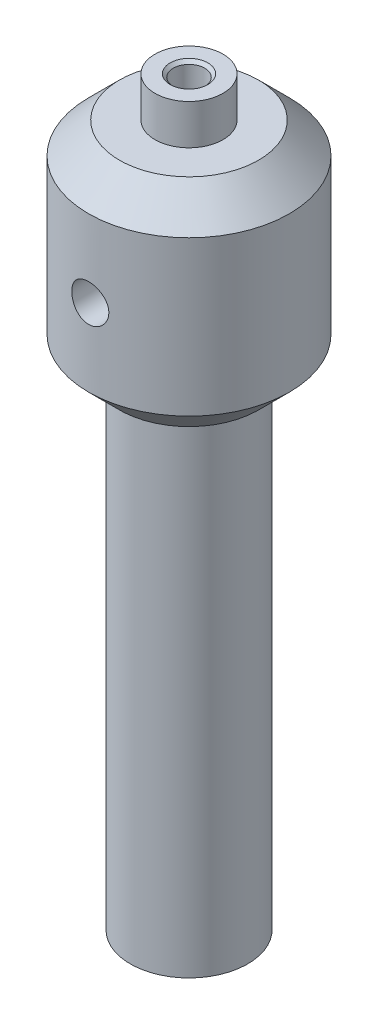
ISO-10303-21;
HEADER;
FILE_DESCRIPTION(('STEP AP214'),'2;1');
FILE_NAME('part.step','',(''),(''),'','','');
FILE_SCHEMA(('AUTOMOTIVE_DESIGN { 1 0 10303 214 1 1 1 1 }'));
ENDSEC;
DATA;
#1=APPLICATION_CONTEXT('core data for automotive mechanical design processes');
#2=APPLICATION_PROTOCOL_DEFINITION('international standard','automotive_design',2000,#1);
#3=PRODUCT_CONTEXT('',#1,'mechanical');
#4=PRODUCT('Part','Part','',(#3));
#5=PRODUCT_RELATED_PRODUCT_CATEGORY('part','',(#4));
#6=PRODUCT_DEFINITION_FORMATION('','',#4);
#7=PRODUCT_DEFINITION_CONTEXT('part definition',#1,'design');
#8=PRODUCT_DEFINITION('design','',#6,#7);
#9=PRODUCT_DEFINITION_SHAPE('','',#8);
#10=(LENGTH_UNIT() NAMED_UNIT(*) SI_UNIT(.MILLI.,.METRE.));
#11=(NAMED_UNIT(*) PLANE_ANGLE_UNIT() SI_UNIT($,.RADIAN.));
#12=(NAMED_UNIT(*) SI_UNIT($,.STERADIAN.) SOLID_ANGLE_UNIT());
#13=UNCERTAINTY_MEASURE_WITH_UNIT(LENGTH_MEASURE(1.E-05),#10,'distance_accuracy_value','');
#14=(GEOMETRIC_REPRESENTATION_CONTEXT(3) GLOBAL_UNCERTAINTY_ASSIGNED_CONTEXT((#13)) GLOBAL_UNIT_ASSIGNED_CONTEXT((#10,
#11,#12)) REPRESENTATION_CONTEXT('',''));
#15=CARTESIAN_POINT('',(0.,0.,0.));
#16=DIRECTION('',(0.,0.,1.));
#17=DIRECTION('',(1.,0.,0.));
#18=AXIS2_PLACEMENT_3D('',#15,#16,#17);
#19=CARTESIAN_POINT('',(19.,0.,0.));
#20=DIRECTION('',(0.,-1.,0.));
#21=DIRECTION('',(0.,0.,-1.));
#22=AXIS2_PLACEMENT_3D('',#19,#20,#21);
#23=PLANE('',#22);
#24=CARTESIAN_POINT('',(0.,0.,0.));
#25=DIRECTION('',(0.,-1.,0.));
#26=DIRECTION('',(0.,0.,-1.));
#27=AXIS2_PLACEMENT_3D('',#24,#25,#26);
#28=CIRCLE('',#27,19.);
#29=CARTESIAN_POINT('',(0.,0.,-19.));
#30=VERTEX_POINT('',#29);
#31=EDGE_CURVE('E62',#30,#30,#28,.T.);
#32=ORIENTED_EDGE('',*,*,#31,.T.);
#33=EDGE_LOOP('',(#32));
#34=FACE_BOUND('',#33,.T.);
#35=ADVANCED_FACE('F41',(#34),#23,.T.);
#36=CARTESIAN_POINT('',(0.,240.,0.));
#37=DIRECTION('',(0.,1.,0.));
#38=DIRECTION('',(0.,0.,1.));
#39=AXIS2_PLACEMENT_3D('',#36,#37,#38);
#40=PLANE('',#39);
#41=CARTESIAN_POINT('',(0.,240.,0.));
#42=DIRECTION('',(0.,1.,0.));
#43=DIRECTION('',(0.,0.,1.));
#44=AXIS2_PLACEMENT_3D('',#41,#42,#43);
#45=CIRCLE('',#44,6.10000000000002);
#46=CARTESIAN_POINT('',(0.,240.,6.10000000000002));
#47=VERTEX_POINT('',#46);
#48=EDGE_CURVE('E11',#47,#47,#45,.F.);
#49=ORIENTED_EDGE('',*,*,#48,.T.);
#50=EDGE_LOOP('',(#49));
#51=FACE_BOUND('',#50,.T.);
#52=CARTESIAN_POINT('',(0.,240.,0.));
#53=DIRECTION('',(0.,-1.,0.));
#54=DIRECTION('',(0.,0.,-1.));
#55=AXIS2_PLACEMENT_3D('',#52,#53,#54);
#56=CIRCLE('',#55,11.);
#57=CARTESIAN_POINT('',(0.,240.,-11.));
#58=VERTEX_POINT('',#57);
#59=EDGE_CURVE('E85',#58,#58,#56,.T.);
#60=ORIENTED_EDGE('',*,*,#59,.F.);
#61=EDGE_LOOP('',(#60));
#62=FACE_BOUND('',#61,.T.);
#63=ADVANCED_FACE('F129',(#51,#62),#40,.T.);
#64=CARTESIAN_POINT('',(0.,0.,0.));
#65=DIRECTION('',(0.,-1.,0.));
#66=DIRECTION('',(0.,0.,-1.));
#67=AXIS2_PLACEMENT_3D('',#64,#65,#66);
#68=CYLINDRICAL_SURFACE('',#67,11.);
#69=ORIENTED_EDGE('',*,*,#59,.T.);
#70=EDGE_LOOP('',(#69));
#71=FACE_BOUND('',#70,.T.);
#72=CARTESIAN_POINT('',(0.,227.,0.));
#73=DIRECTION('',(0.,-1.,0.));
#74=DIRECTION('',(0.,0.,-1.));
#75=AXIS2_PLACEMENT_3D('',#72,#73,#74);
#76=CIRCLE('',#75,11.);
#77=CARTESIAN_POINT('',(0.,227.,-11.));
#78=VERTEX_POINT('',#77);
#79=EDGE_CURVE('E82',#78,#78,#76,.T.);
#80=ORIENTED_EDGE('',*,*,#79,.F.);
#81=EDGE_LOOP('',(#80));
#82=FACE_BOUND('',#81,.T.);
#83=ADVANCED_FACE('F134',(#71,#82),#68,.T.);
#84=CARTESIAN_POINT('',(11.,227.,0.));
#85=DIRECTION('',(0.,1.,0.));
#86=DIRECTION('',(0.,0.,1.));
#87=AXIS2_PLACEMENT_3D('',#84,#85,#86);
#88=PLANE('',#87);
#89=ORIENTED_EDGE('',*,*,#79,.T.);
#90=EDGE_LOOP('',(#89));
#91=FACE_BOUND('',#90,.T.);
#92=CARTESIAN_POINT('',(0.,227.,0.));
#93=DIRECTION('',(0.,-1.,0.));
#94=DIRECTION('',(0.,0.,-1.));
#95=AXIS2_PLACEMENT_3D('',#92,#93,#94);
#96=CIRCLE('',#95,22.5);
#97=CARTESIAN_POINT('',(0.,227.,-22.5));
#98=VERTEX_POINT('',#97);
#99=EDGE_CURVE('E79',#98,#98,#96,.T.);
#100=ORIENTED_EDGE('',*,*,#99,.F.);
#101=EDGE_LOOP('',(#100));
#102=FACE_BOUND('',#101,.T.);
#103=ADVANCED_FACE('F140',(#91,#102),#88,.T.);
#104=CARTESIAN_POINT('',(0.,217.,0.));
#105=DIRECTION('',(0.,-1.,0.));
#106=DIRECTION('',(0.,0.,-1.));
#107=AXIS2_PLACEMENT_3D('',#104,#105,#106);
#108=CONICAL_SURFACE('',#107,32.5000000000002,0.785398163397456);
#109=ORIENTED_EDGE('',*,*,#99,.T.);
#110=EDGE_LOOP('',(#109));
#111=FACE_BOUND('',#110,.T.);
#112=CARTESIAN_POINT('',(0.,217.,0.));
#113=DIRECTION('',(0.,-1.,0.));
#114=DIRECTION('',(0.,0.,-1.));
#115=AXIS2_PLACEMENT_3D('',#112,#113,#114);
#116=CIRCLE('',#115,32.5000000000002);
#117=CARTESIAN_POINT('',(0.,217.,-32.5000000000002));
#118=VERTEX_POINT('',#117);
#119=EDGE_CURVE('E76',#118,#118,#116,.T.);
#120=ORIENTED_EDGE('',*,*,#119,.F.);
#121=EDGE_LOOP('',(#120));
#122=FACE_BOUND('',#121,.T.);
#123=ADVANCED_FACE('F125',(#111,#122),#108,.T.);
#124=CARTESIAN_POINT('',(0.,0.,0.));
#125=DIRECTION('',(0.,-1.,0.));
#126=DIRECTION('',(0.,0.,-1.));
#127=AXIS2_PLACEMENT_3D('',#124,#125,#126);
#128=CYLINDRICAL_SURFACE('',#127,32.5000000000002);
#129=CARTESIAN_POINT('',(0.,198.,-32.5000000000002));
#130=CARTESIAN_POINT('',(0.167047387974415,198.000002951048,-32.5000014014325));
#131=CARTESIAN_POINT('',(0.334056414535266,197.993021813711,-32.4987097779942));
#132=CARTESIAN_POINT('',(0.666922031200579,197.965157067144,-32.493582396858));
#133=CARTESIAN_POINT('',(0.832778404858182,197.944270914476,-32.4897461737149));
#134=CARTESIAN_POINT('',(1.16218709311425,197.888738536972,-32.4796320956754));
#135=CARTESIAN_POINT('',(1.32573803450885,197.854084442608,-32.4733528444275));
#136=CARTESIAN_POINT('',(1.64934345668916,197.771271041131,-32.4585259988951));
#137=CARTESIAN_POINT('',(1.80939663010089,197.72310677428,-32.4499775716322));
#138=CARTESIAN_POINT('',(2.12461909376536,197.613714664144,-32.4308633624609));
#139=CARTESIAN_POINT('',(2.27979434281074,197.552503531731,-32.4203001629445));
#140=CARTESIAN_POINT('',(2.58446206954016,197.417410303793,-32.397436680922));
#141=CARTESIAN_POINT('',(2.73395242740516,197.34352353721,-32.3851357583493));
#142=CARTESIAN_POINT('',(3.02610605021081,197.1836663224,-32.359143729032));
#143=CARTESIAN_POINT('',(3.16877249289802,197.097701573525,-32.345453278818));
#144=CARTESIAN_POINT('',(3.44644953798866,196.914233178875,-32.3170461894861));
#145=CARTESIAN_POINT('',(3.5814572600222,196.816725233819,-32.3023291688643));
#146=CARTESIAN_POINT('',(3.84417623264325,196.609831402662,-32.2721237443793));
#147=CARTESIAN_POINT('',(3.97180053780939,196.500336011848,-32.2566290755319));
#148=CARTESIAN_POINT('',(4.21744501771729,196.27099554245,-32.2254324395733));
#149=CARTESIAN_POINT('',(4.33546161754138,196.151146645324,-32.2097303978038));
#150=CARTESIAN_POINT('',(4.56100087376238,195.901986604755,-32.1785678807608));
#151=CARTESIAN_POINT('',(4.66852662807659,195.772678274512,-32.1631073353137));
#152=CARTESIAN_POINT('',(4.87241936155105,195.505394933914,-32.1328517105624));
#153=CARTESIAN_POINT('',(4.96878221059233,195.36741674477,-32.1180568787933));
#154=CARTESIAN_POINT('',(5.15028638072951,195.082734596099,-32.0894539852936));
#155=CARTESIAN_POINT('',(5.23534055334004,194.935974240216,-32.0756539245592));
#156=CARTESIAN_POINT('',(5.39279796033512,194.635620840363,-32.0495569658408));
#157=CARTESIAN_POINT('',(5.46519645843932,194.482025265232,-32.0372606311285));
#158=CARTESIAN_POINT('',(5.59673049546195,194.169186629211,-32.0145447471989));
#159=CARTESIAN_POINT('',(5.65587180506682,194.00994606061,-32.0041243817863));
#160=CARTESIAN_POINT('',(5.76049139817701,193.68689735635,-31.9854579827383));
#161=CARTESIAN_POINT('',(5.80596470935164,193.523087582069,-31.9772127405321));
#162=CARTESIAN_POINT('',(5.9203689764524,193.030409159429,-31.9563064605377));
#163=CARTESIAN_POINT('',(5.96891901071691,192.696386732529,-31.9471824578803));
#164=CARTESIAN_POINT('',(6.0093777303918,192.025005778692,-31.9395955731687));
#165=CARTESIAN_POINT('',(6.00129133836947,191.687647544233,-31.9411317645813));
#166=CARTESIAN_POINT('',(5.92929348899846,191.023490395548,-31.9545734655923));
#167=CARTESIAN_POINT('',(5.86609521960248,190.696611688162,-31.9663464973698));
#168=CARTESIAN_POINT('',(5.68676990030916,190.058190702375,-31.9987323168556));
#169=CARTESIAN_POINT('',(5.57064066366295,189.746649058187,-32.0193454697759));
#170=CARTESIAN_POINT('',(5.28805391152012,189.145635615852,-32.067226849282));
#171=CARTESIAN_POINT('',(5.12130716064853,188.856302952439,-32.0945331440216));
#172=CARTESIAN_POINT('',(4.74242193954202,188.30945617947,-32.1526990787037));
#173=CARTESIAN_POINT('',(4.53027899873099,188.051945207629,-32.1835590684725));
#174=CARTESIAN_POINT('',(4.0627715303044,187.571927527527,-32.245933335709));
#175=CARTESIAN_POINT('',(3.80679653324244,187.350015311049,-32.2774504088929));
#176=CARTESIAN_POINT('',(3.2609369532924,186.952194045544,-32.3371543132374));
#177=CARTESIAN_POINT('',(2.97105204985808,186.776285431433,-32.3653411129124));
#178=CARTESIAN_POINT('',(2.36499021324981,186.475381996096,-32.4152628733549));
#179=CARTESIAN_POINT('',(2.04878258243285,186.350447651793,-32.4369901621848));
#180=CARTESIAN_POINT('',(1.39937919492224,186.155633070481,-32.4714852504941));
#181=CARTESIAN_POINT('',(1.06618519067571,186.085747166433,-32.4842539722109));
#182=CARTESIAN_POINT('',(0.397383215203499,186.003837604151,-32.4992669465581));
#183=CARTESIAN_POINT('',(0.0618782483745503,185.990999171889,-32.5016593853385));
#184=CARTESIAN_POINT('',(-0.606484909661271,186.021365382145,-32.4960590637381));
#185=CARTESIAN_POINT('',(-0.939343226021676,186.064567358601,-32.4880667973983));
#186=CARTESIAN_POINT('',(-1.59038992422883,186.205110554301,-32.4626872786009));
#187=CARTESIAN_POINT('',(-1.90867005010831,186.302040788101,-32.4453713741911));
#188=CARTESIAN_POINT('',(-2.52446187534885,186.546845306371,-32.4032781211014));
#189=CARTESIAN_POINT('',(-2.82197219688196,186.694722966739,-32.3785002779895));
#190=CARTESIAN_POINT('',(-3.39126548533968,187.039036730946,-32.323862034222));
#191=CARTESIAN_POINT('',(-3.66274135122632,187.235972303467,-32.2939504055838));
#192=CARTESIAN_POINT('',(-4.16908432952835,187.672135346245,-32.2324977111766));
#193=CARTESIAN_POINT('',(-4.40394813141742,187.911366636785,-32.2009564984006));
#194=CARTESIAN_POINT('',(-4.83348551479758,188.429009489889,-32.139309512383));
#195=CARTESIAN_POINT('',(-5.02760384169283,188.707885037177,-32.1092273941106));
#196=CARTESIAN_POINT('',(-5.36623841659488,189.29477862801,-32.0543763326786));
#197=CARTESIAN_POINT('',(-5.51075647264597,189.602795608759,-32.0296071958608));
#198=CARTESIAN_POINT('',(-5.74529998594317,190.237733868761,-31.9883683472534));
#199=CARTESIAN_POINT('',(-5.83558308225325,190.564557555855,-31.9718594593374));
#200=CARTESIAN_POINT('',(-5.95987109852571,191.229255527096,-31.9489294956882));
#201=CARTESIAN_POINT('',(-5.9938821523063,191.567128602733,-31.9425073204776));
#202=CARTESIAN_POINT('',(-6.00189486714629,192.071678138939,-31.9409937887348));
#203=CARTESIAN_POINT('',(-5.99758283494899,192.238274119685,-31.9418077558085));
#204=CARTESIAN_POINT('',(-5.97513253775216,192.570482113081,-31.946016487723));
#205=CARTESIAN_POINT('',(-5.95699949373229,192.736094473498,-31.9494102780172));
#206=CARTESIAN_POINT('',(-5.9070336299794,193.065215620485,-31.9586855963116));
#207=CARTESIAN_POINT('',(-5.87519596756223,193.228723642411,-31.9645680036806));
#208=CARTESIAN_POINT('',(-5.79808429743152,193.552378272652,-31.9786453020171));
#209=CARTESIAN_POINT('',(-5.75281510317849,193.712526063197,-31.9868393645047));
#210=CARTESIAN_POINT('',(-5.6492524053349,194.028176622226,-32.0052918435402));
#211=CARTESIAN_POINT('',(-5.59097742811479,194.183685644782,-32.0155473216156));
#212=CARTESIAN_POINT('',(-5.46182056358106,194.489178204963,-32.0378339830432));
#213=CARTESIAN_POINT('',(-5.39094316290595,194.63916368618,-32.0498645341862));
#214=CARTESIAN_POINT('',(-5.23704527717771,194.932717658784,-32.0753712303173));
#215=CARTESIAN_POINT('',(-5.15401988366899,195.076283525534,-32.088847959051));
#216=CARTESIAN_POINT('',(-4.97646002457541,195.35593046589,-32.1168634444834));
#217=CARTESIAN_POINT('',(-4.88192955508218,195.492014114611,-32.1314018317355));
#218=CARTESIAN_POINT('',(-4.68049098336987,195.757821711608,-32.1613669342855));
#219=CARTESIAN_POINT('',(-4.5734194828492,195.887420733857,-32.1768036560181));
#220=CARTESIAN_POINT('',(-4.34884138360293,196.137120438952,-32.2079248208259));
#221=CARTESIAN_POINT('',(-4.23133849380697,196.257224469299,-32.2236091742368));
#222=CARTESIAN_POINT('',(-3.98659111868758,196.487238515557,-32.2548029719055));
#223=CARTESIAN_POINT('',(-3.85934088957488,196.597142435201,-32.2703123067587));
#224=CARTESIAN_POINT('',(-3.59607102507715,196.805880120683,-32.3007093143121));
#225=CARTESIAN_POINT('',(-3.46005463969105,196.904717952427,-32.3155972140708));
#226=CARTESIAN_POINT('',(-3.1788578643114,197.091523494682,-32.3444742543557));
#227=CARTESIAN_POINT('',(-3.03360543194256,197.179384266206,-32.3584539984356));
#228=CARTESIAN_POINT('',(-2.7361329268486,197.342503362623,-32.3849635764461));
#229=CARTESIAN_POINT('',(-2.58391544613779,197.417766327943,-32.3974939437297));
#230=CARTESIAN_POINT('',(-2.27362825228652,197.555121589046,-32.4207463085124));
#231=CARTESIAN_POINT('',(-2.11556241225017,197.617222424426,-32.4314694775918));
#232=CARTESIAN_POINT('',(-1.79467228319851,197.727823393983,-32.4508090321668));
#233=CARTESIAN_POINT('',(-1.63184896912176,197.776326293468,-32.45942584597));
#234=CARTESIAN_POINT('',(-1.22783758338942,197.878204607649,-32.4776798969896));
#235=CARTESIAN_POINT('',(-0.98458873619416,197.923819554013,-32.486008622075));
#236=CARTESIAN_POINT('',(-0.49419856019614,197.984714702236,-32.4971675709577));
#237=CARTESIAN_POINT('',(-0.247057325390453,197.999995635502,-32.4999979273301));
#238=CARTESIAN_POINT('',(0.,198.,-32.5000000000002));
#239=B_SPLINE_CURVE_WITH_KNOTS('',3,(#129,#130,#131,#132,#133,#134,#135,#136,#137,#138,#139,
#140,#141,#142,#143,#144,#145,#146,#147,#148,#149,#150,#151,#152,#153,#154,#155,#156,#157,#158,
#159,#160,#161,#162,#163,#164,#165,#166,#167,#168,#169,#170,#171,#172,#173,#174,#175,#176,#177,
#178,#179,#180,#181,#182,#183,#184,#185,#186,#187,#188,#189,#190,#191,#192,#193,#194,#195,#196,
#197,#198,#199,#200,#201,#202,#203,#204,#205,#206,#207,#208,#209,#210,#211,#212,#213,#214,#215,
#216,#217,#218,#219,#220,#221,#222,#223,#224,#225,#226,#227,#228,#229,#230,#231,#232,#233,#234,
#235,#236,#237,#238),.UNSPECIFIED.,.T.,.F.,(4,2,2,2,2,2,2,2,2,2,2,2,2,2,2,2,2,2,2,2,2,2,2,2,2,2,
2,2,2,2,2,2,2,2,2,2,2,2,2,2,2,2,2,2,2,2,2,2,2,2,2,2,2,2,4),(0.,0.500925415856109,
1.00194248373588,1.50324633759921,2.00473446721871,2.50558409263794,3.00661868254917,
3.50741763369361,4.00840369848706,4.51442366052909,5.0206310543591,5.52668851124021,
6.03293260831374,6.5428761417078,7.05301011052263,7.5629215914048,8.07301835093453,
9.08064758459464,10.088189241028,11.0828828743722,12.0776176054417,13.0781469402784,
14.0787748517292,15.0946807664379,16.1105962851585,17.1277136264852,18.144726245551,
19.147165819545,20.1495577053301,21.1443857119725,22.1392796509597,23.1447493595254,
24.1503099317355,25.1687925873858,26.1872381130497,27.2008065243771,28.2142644464847,
28.7137382676778,29.2130235027488,29.7124853110036,30.2117683427893,30.7103446486533,
31.2087438085096,31.7073449079496,32.2057733184101,32.711626137455,33.2172998130326,
33.7232737924587,34.2290612523622,34.7394448349454,35.2496400010553,35.7595031320703,
36.2692625008281,37.0101317779487,37.7509831912043),.UNSPECIFIED.);
#240=CARTESIAN_POINT('',(0.,198.,-32.5000000000002));
#241=VERTEX_POINT('',#240);
#242=EDGE_CURVE('E96',#241,#241,#239,.T.);
#243=ORIENTED_EDGE('',*,*,#242,.F.);
#244=EDGE_LOOP('',(#243));
#245=FACE_BOUND('',#244,.T.);
#246=CARTESIAN_POINT('',(6.,192.,31.9413525073691));
#247=CARTESIAN_POINT('',(6.00000295853529,192.16702010578,31.9413510155269));
#248=CARTESIAN_POINT('',(5.99302407715925,192.334001842829,31.942665010277));
#249=CARTESIAN_POINT('',(5.96516856930218,192.666812138617,31.9478791151136));
#250=CARTESIAN_POINT('',(5.94428939706712,192.832640480497,31.9517796989177));
#251=CARTESIAN_POINT('',(5.88877610738075,193.161992514205,31.9620573065451));
#252=CARTESIAN_POINT('',(5.85413407949497,193.325514824534,31.968435754516));
#253=CARTESIAN_POINT('',(5.77135045100129,193.649062361184,31.9834845406128));
#254=CARTESIAN_POINT('',(5.72320388723112,193.80908627843,31.9921557212923));
#255=CARTESIAN_POINT('',(5.61385452206621,194.124246490147,32.0115246934937));
#256=CARTESIAN_POINT('',(5.55266878540925,194.279388871567,32.0222198341719));
#257=CARTESIAN_POINT('',(5.41763251250718,194.583993638257,32.0453420785028));
#258=CARTESIAN_POINT('',(5.34377730623473,194.733453904166,32.057769820483));
#259=CARTESIAN_POINT('',(5.18398806674358,195.025552629714,32.0839962627163));
#260=CARTESIAN_POINT('',(5.09805970034271,195.168194247985,32.097794318895));
#261=CARTESIAN_POINT('',(4.91466745622353,195.445828347411,32.1263856672195));
#262=CARTESIAN_POINT('',(4.81719927981946,195.580817950254,32.1411793293465));
#263=CARTESIAN_POINT('',(4.61034548396164,195.843560996205,32.1715052735181));
#264=CARTESIAN_POINT('',(4.50084597428911,195.971224083592,32.187043658493));
#265=CARTESIAN_POINT('',(4.27148905640616,196.216946537089,32.2182832804326));
#266=CARTESIAN_POINT('',(4.15162782612189,196.335002327964,32.2339845755937));
#267=CARTESIAN_POINT('',(3.90243530466569,196.560618341113,32.2651012097676));
#268=CARTESIAN_POINT('',(3.77310687922168,196.668181716642,32.2805166335574));
#269=CARTESIAN_POINT('',(3.50577559302648,196.872146891922,32.3106427456996));
#270=CARTESIAN_POINT('',(3.36776955266251,196.968544563181,32.3253531722097));
#271=CARTESIAN_POINT('',(3.08306471017447,197.150088678451,32.3537527138726));
#272=CARTESIAN_POINT('',(2.93631162303768,197.235151271087,32.3674339230624));
#273=CARTESIAN_POINT('',(2.63597199364875,197.39262626248,32.3932768150284));
#274=CARTESIAN_POINT('',(2.48238292019942,197.465033925708,32.4054379284952));
#275=CARTESIAN_POINT('',(2.16955749285648,197.596586679502,32.427882597685));
#276=CARTESIAN_POINT('',(2.01032361299023,197.655737499093,32.438166964097));
#277=CARTESIAN_POINT('',(1.6872898594089,197.760376316327,32.4565759252549));
#278=CARTESIAN_POINT('',(1.52348834648181,197.805859338139,32.4646997333149));
#279=CARTESIAN_POINT('',(1.03085331580682,197.920290031532,32.4852880303494));
#280=CARTESIAN_POINT('',(0.696870045496306,197.96886042554,32.4942588120659));
#281=CARTESIAN_POINT('',(0.0255664198837383,198.009373397857,32.5017263371875));
#282=CARTESIAN_POINT('',(-0.31175365726685,198.001320657124,32.5002239463957));
#283=CARTESIAN_POINT('',(-0.976054278284206,197.929377926863,32.487017631085));
#284=CARTESIAN_POINT('',(-1.30311063675732,197.866167164928,32.4754378068715));
#285=CARTESIAN_POINT('',(-1.94188038235149,197.686755984159,32.4435119174274));
#286=CARTESIAN_POINT('',(-2.25359322258673,197.570553678071,32.423165539984));
#287=CARTESIAN_POINT('',(-2.85482127182886,197.287811975478,32.3757858792466));
#288=CARTESIAN_POINT('',(-3.14420524520471,197.12099977746,32.3487165042423));
#289=CARTESIAN_POINT('',(-3.69112726413706,196.741972872398,32.2908861364094));
#290=CARTESIAN_POINT('',(-3.94866216241414,196.529753683949,32.2601247793354));
#291=CARTESIAN_POINT('',(-4.42860067861482,196.062189714966,32.1977799600075));
#292=CARTESIAN_POINT('',(-4.65042497033573,195.806250600413,32.1661910748593));
#293=CARTESIAN_POINT('',(-5.04808559706013,195.260494957064,32.1061894073336));
#294=CARTESIAN_POINT('',(-5.22392129912474,194.970677962086,32.0777766686722));
#295=CARTESIAN_POINT('',(-5.52477115699434,194.364639341077,32.0273370970674));
#296=CARTESIAN_POINT('',(-5.64970322536738,194.048376049523,32.0053205950003));
#297=CARTESIAN_POINT('',(-5.84449643174312,193.398850988088,31.9703261346545));
#298=CARTESIAN_POINT('',(-5.9143636046489,193.065591085235,31.9573471859126));
#299=CARTESIAN_POINT('',(-5.99620229168364,192.396751015839,31.9420927158334));
#300=CARTESIAN_POINT('',(-6.00900518397556,192.061275977497,31.9396635072361));
#301=CARTESIAN_POINT('',(-5.97857858316261,191.392981018201,31.9453725765506));
#302=CARTESIAN_POINT('',(-5.93535177193744,191.060160970932,31.9535103486705));
#303=CARTESIAN_POINT('',(-5.79480586142508,190.409343291511,31.9792934650262));
#304=CARTESIAN_POINT('',(-5.69792075735498,190.091248642484,31.9968624934419));
#305=CARTESIAN_POINT('',(-5.45326809850267,189.475807966959,32.0394630353326));
#306=CARTESIAN_POINT('',(-5.30549689375587,189.178463430668,32.0644950840988));
#307=CARTESIAN_POINT('',(-4.96134651750513,188.609295414165,32.1195522144907));
#308=CARTESIAN_POINT('',(-4.76444105467972,188.337795366043,32.1496301190141));
#309=CARTESIAN_POINT('',(-4.32832188526401,187.831389726128,32.2112404635559));
#310=CARTESIAN_POINT('',(-4.08910449593802,187.596487323062,32.2427730300081));
#311=CARTESIAN_POINT('',(-3.57144762775753,187.166848798412,32.3042327039955));
#312=CARTESIAN_POINT('',(-3.29254111714155,186.972671136173,32.3341337897013));
#313=CARTESIAN_POINT('',(-2.70556807005943,186.633932586305,32.3885259688711));
#314=CARTESIAN_POINT('',(-2.39750263248844,186.489369829818,32.4130172660945));
#315=CARTESIAN_POINT('',(-1.76258072681929,186.254800177585,32.4537208129972));
#316=CARTESIAN_POINT('',(-1.435829080217,186.164516450471,32.4699750052545));
#317=CARTESIAN_POINT('',(-0.771284675971637,186.040202759824,32.492542256214));
#318=CARTESIAN_POINT('',(-0.433493046619088,186.00616706594,32.4988563275775));
#319=CARTESIAN_POINT('',(0.0710321096354826,185.998095984879,32.5003540565633));
#320=CARTESIAN_POINT('',(0.237682638844521,186.002392189745,32.4995572690842));
#321=CARTESIAN_POINT('',(0.57000147357403,186.024820064111,32.4954244329522));
#322=CARTESIAN_POINT('',(0.73567012605006,186.042946511486,32.4920893427313));
#323=CARTESIAN_POINT('',(1.06490505616126,186.092908806817,32.4829668638017));
#324=CARTESIAN_POINT('',(1.22847057559065,186.124749463685,32.4771786148999));
#325=CARTESIAN_POINT('',(1.55224085017753,186.201877246057,32.4633144843587));
#326=CARTESIAN_POINT('',(1.71244678909536,186.247159547125,32.4552394235428));
#327=CARTESIAN_POINT('',(2.02822736208988,186.350763583394,32.4370355937858));
#328=CARTESIAN_POINT('',(2.18380784113109,186.409067993915,32.4269095551276));
#329=CARTESIAN_POINT('',(2.48943892302125,186.538295909441,32.404878671661));
#330=CARTESIAN_POINT('',(2.63949147339193,186.609214917922,32.3929744609305));
#331=CARTESIAN_POINT('',(2.9331721059094,186.763206776707,32.3677035827216));
#332=CARTESIAN_POINT('',(3.07679757825834,186.846284506776,32.3543363286128));
#333=CARTESIAN_POINT('',(3.35655401432149,187.023957979389,32.3265108155522));
#334=CARTESIAN_POINT('',(3.49268756010243,187.118549717111,32.312052936605));
#335=CARTESIAN_POINT('',(3.75850222746007,187.32005643899,32.2822211930689));
#336=CARTESIAN_POINT('',(3.88806348648545,187.427128074562,32.2668371982914));
#337=CARTESIAN_POINT('',(4.13768673508279,187.651698606635,32.2357777361539));
#338=CARTESIAN_POINT('',(4.25775207244291,187.769193797036,32.2201023739443));
#339=CARTESIAN_POINT('',(4.48768949162614,188.013917992755,32.1888818740742));
#340=CARTESIAN_POINT('',(4.59755543208625,188.141152779532,32.1733368199348));
#341=CARTESIAN_POINT('',(4.8062192058397,188.40438395591,32.1428277311299));
#342=CARTESIAN_POINT('',(4.9050210981696,188.540377103324,32.1278634847104));
#343=CARTESIAN_POINT('',(5.09178042683274,188.821553772614,32.098797335525));
#344=CARTESIAN_POINT('',(5.17962815718121,188.966811164144,32.0847047744442));
#345=CARTESIAN_POINT('',(5.34272083193666,189.264291908901,32.0579500798173));
#346=CARTESIAN_POINT('',(5.41797041710961,189.416512670611,32.0452874201018));
#347=CARTESIAN_POINT('',(5.55529909721156,189.726805727056,32.0217661734499));
#348=CARTESIAN_POINT('',(5.61738677931815,189.884874127068,32.0109064112643));
#349=CARTESIAN_POINT('',(5.72796202752486,190.205770370251,31.9913049603578));
#350=CARTESIAN_POINT('',(5.7764523672906,190.36859723527,31.9825628397176));
#351=CARTESIAN_POINT('',(5.87827970156251,190.772538416944,31.9640370171762));
#352=CARTESIAN_POINT('',(5.92386631533029,191.015711803916,31.9555746068074));
#353=CARTESIAN_POINT('',(5.9847238866214,191.505951494842,31.944233526856));
#354=CARTESIAN_POINT('',(5.99999562504256,191.753017698353,31.9413547134425));
#355=CARTESIAN_POINT('',(6.,192.,31.9413525073691));
#356=B_SPLINE_CURVE_WITH_KNOTS('',3,(#246,#247,#248,#249,#250,#251,#252,#253,#254,#255,#256,
#257,#258,#259,#260,#261,#262,#263,#264,#265,#266,#267,#268,#269,#270,#271,#272,#273,#274,#275,
#276,#277,#278,#279,#280,#281,#282,#283,#284,#285,#286,#287,#288,#289,#290,#291,#292,#293,#294,
#295,#296,#297,#298,#299,#300,#301,#302,#303,#304,#305,#306,#307,#308,#309,#310,#311,#312,#313,
#314,#315,#316,#317,#318,#319,#320,#321,#322,#323,#324,#325,#326,#327,#328,#329,#330,#331,#332,
#333,#334,#335,#336,#337,#338,#339,#340,#341,#342,#343,#344,#345,#346,#347,#348,#349,#350,#351,
#352,#353,#354,#355),.UNSPECIFIED.,.T.,.F.,(4,2,2,2,2,2,2,2,2,2,2,2,2,2,2,2,2,2,2,2,2,2,2,2,2,2,
2,2,2,2,2,2,2,2,2,2,2,2,2,2,2,2,2,2,2,2,2,2,2,2,2,2,2,2,4),(0.,0.500843463331355,
1.0017786783503,1.50300223188232,2.00441023608585,2.50516601956036,3.00610678220385,
3.50681319732151,4.00770672054381,4.51383441416538,5.02014960364326,5.52631215984354,
6.03266127501116,6.542569670539,7.05266846938636,7.56254639910261,8.07260972824401,
9.08012563787736,10.087558258518,11.082757472296,12.0779921321037,13.0786896815496,
14.0794860395937,15.0951637423724,16.1108554231421,17.128178591491,18.1453902495802,
19.1477325069966,20.1500267887514,21.144330335666,22.1387052169704,23.1442262843942,
24.1498349132333,25.1684425209453,26.1870117562707,27.2003410634462,28.2135671298398,
28.7132031034217,29.2126505140953,29.7122731996683,30.2117167784932,30.7104998117236,
31.2091054067348,31.7079116630686,32.2065449168668,32.7122968113089,33.217869600612,
33.7237448623405,34.2294339227625,34.7398381371698,35.2500539188164,35.7599357905254,
36.2697135777541,37.010358887058,37.7509851174174),.UNSPECIFIED.);
#357=CARTESIAN_POINT('',(6.,192.,31.9413525073691));
#358=VERTEX_POINT('',#357);
#359=EDGE_CURVE('E88',#358,#358,#356,.T.);
#360=ORIENTED_EDGE('',*,*,#359,.F.);
#361=EDGE_LOOP('',(#360));
#362=FACE_BOUND('',#361,.T.);
#363=ORIENTED_EDGE('',*,*,#119,.T.);
#364=EDGE_LOOP('',(#363));
#365=FACE_BOUND('',#364,.T.);
#366=CARTESIAN_POINT('',(0.,166.999999999999,0.));
#367=DIRECTION('',(0.,-1.,0.));
#368=DIRECTION('',(0.,0.,-1.));
#369=AXIS2_PLACEMENT_3D('',#366,#367,#368);
#370=CIRCLE('',#369,32.5000000000002);
#371=CARTESIAN_POINT('',(0.,166.999999999999,-32.5000000000002));
#372=VERTEX_POINT('',#371);
#373=EDGE_CURVE('E73',#372,#372,#370,.T.);
#374=ORIENTED_EDGE('',*,*,#373,.F.);
#375=EDGE_LOOP('',(#374));
#376=FACE_BOUND('',#375,.T.);
#377=ADVANCED_FACE('F100',(#245,#362,#365,#376),#128,.T.);
#378=CARTESIAN_POINT('',(0.,157.,0.));
#379=DIRECTION('',(0.,1.,0.));
#380=DIRECTION('',(0.,0.,1.));
#381=AXIS2_PLACEMENT_3D('',#378,#379,#380);
#382=CONICAL_SURFACE('',#381,22.5,0.785398163397498);
#383=ORIENTED_EDGE('',*,*,#373,.T.);
#384=EDGE_LOOP('',(#383));
#385=FACE_BOUND('',#384,.T.);
#386=CARTESIAN_POINT('',(0.,157.,0.));
#387=DIRECTION('',(0.,-1.,0.));
#388=DIRECTION('',(0.,0.,-1.));
#389=AXIS2_PLACEMENT_3D('',#386,#387,#388);
#390=CIRCLE('',#389,22.5);
#391=CARTESIAN_POINT('',(0.,157.,-22.5));
#392=VERTEX_POINT('',#391);
#393=EDGE_CURVE('E70',#392,#392,#390,.T.);
#394=ORIENTED_EDGE('',*,*,#393,.F.);
#395=EDGE_LOOP('',(#394));
#396=FACE_BOUND('',#395,.T.);
#397=ADVANCED_FACE('F118',(#385,#396),#382,.T.);
#398=CARTESIAN_POINT('',(22.5,157.,0.));
#399=DIRECTION('',(0.,-1.,0.));
#400=DIRECTION('',(0.,0.,-1.));
#401=AXIS2_PLACEMENT_3D('',#398,#399,#400);
#402=PLANE('',#401);
#403=ORIENTED_EDGE('',*,*,#393,.T.);
#404=EDGE_LOOP('',(#403));
#405=FACE_BOUND('',#404,.T.);
#406=CARTESIAN_POINT('',(0.,157.,0.));
#407=DIRECTION('',(0.,-1.,0.));
#408=DIRECTION('',(0.,0.,-1.));
#409=AXIS2_PLACEMENT_3D('',#406,#407,#408);
#410=CIRCLE('',#409,19.);
#411=CARTESIAN_POINT('',(0.,157.,-19.));
#412=VERTEX_POINT('',#411);
#413=EDGE_CURVE('E65',#412,#412,#410,.T.);
#414=ORIENTED_EDGE('',*,*,#413,.F.);
#415=EDGE_LOOP('',(#414));
#416=FACE_BOUND('',#415,.T.);
#417=ADVANCED_FACE('F115',(#405,#416),#402,.T.);
#418=CARTESIAN_POINT('',(0.,0.,0.));
#419=DIRECTION('',(0.,-1.,0.));
#420=DIRECTION('',(0.,0.,-1.));
#421=AXIS2_PLACEMENT_3D('',#418,#419,#420);
#422=CYLINDRICAL_SURFACE('',#421,19.);
#423=ORIENTED_EDGE('',*,*,#413,.T.);
#424=EDGE_LOOP('',(#423));
#425=FACE_BOUND('',#424,.T.);
#426=ORIENTED_EDGE('',*,*,#31,.F.);
#427=EDGE_LOOP('',(#426));
#428=FACE_BOUND('',#427,.T.);
#429=ADVANCED_FACE('F56',(#425,#428),#422,.T.);
#430=CARTESIAN_POINT('',(0.,205.,0.));
#431=DIRECTION('',(0.,1.,0.));
#432=DIRECTION('',(0.,0.,1.));
#433=AXIS2_PLACEMENT_3D('',#430,#431,#432);
#434=CONICAL_SURFACE('',#433,5.09999999999999,1.02974425867665);
#435=CARTESIAN_POINT('',(0.,201.935610842959,0.));
#436=VERTEX_POINT('',#435);
#437=VERTEX_LOOP('',#436);
#438=FACE_BOUND('',#437,.T.);
#439=CARTESIAN_POINT('',(0.,205.,0.));
#440=DIRECTION('',(0.,1.,0.));
#441=DIRECTION('',(0.,0.,1.));
#442=AXIS2_PLACEMENT_3D('',#439,#440,#441);
#443=CIRCLE('',#442,5.09999999999999);
#444=CARTESIAN_POINT('',(0.,205.,5.09999999999999));
#445=VERTEX_POINT('',#444);
#446=EDGE_CURVE('E60',#445,#445,#443,.T.);
#447=ORIENTED_EDGE('',*,*,#446,.T.);
#448=EDGE_LOOP('',(#447));
#449=FACE_BOUND('',#448,.T.);
#450=ADVANCED_FACE('F52',(#438,#449),#434,.F.);
#451=CARTESIAN_POINT('',(0.,240.,0.));
#452=DIRECTION('',(0.,1.,0.));
#453=DIRECTION('',(0.,0.,1.));
#454=AXIS2_PLACEMENT_3D('',#451,#452,#453);
#455=CYLINDRICAL_SURFACE('',#454,5.09999999999999);
#456=CARTESIAN_POINT('',(0.,239.,0.));
#457=DIRECTION('',(0.,1.,0.));
#458=DIRECTION('',(0.,0.,1.));
#459=AXIS2_PLACEMENT_3D('',#456,#457,#458);
#460=CIRCLE('',#459,5.09999999999999);
#461=CARTESIAN_POINT('',(0.,239.,5.09999999999999));
#462=VERTEX_POINT('',#461);
#463=EDGE_CURVE('E49',#462,#462,#460,.T.);
#464=ORIENTED_EDGE('',*,*,#463,.T.);
#465=EDGE_LOOP('',(#464));
#466=FACE_BOUND('',#465,.T.);
#467=ORIENTED_EDGE('',*,*,#446,.F.);
#468=EDGE_LOOP('',(#467));
#469=FACE_BOUND('',#468,.T.);
#470=ADVANCED_FACE('F55',(#466,#469),#455,.F.);
#471=CARTESIAN_POINT('',(0.,192.,-32.5000000000002));
#472=DIRECTION('',(0.,0.,1.));
#473=DIRECTION('',(1.,0.,0.));
#474=AXIS2_PLACEMENT_3D('',#471,#472,#473);
#475=CYLINDRICAL_SURFACE('',#474,6.);
#476=ORIENTED_EDGE('',*,*,#242,.T.);
#477=EDGE_LOOP('',(#476));
#478=FACE_BOUND('',#477,.T.);
#479=ORIENTED_EDGE('',*,*,#359,.T.);
#480=EDGE_LOOP('',(#479));
#481=FACE_BOUND('',#480,.T.);
#482=ADVANCED_FACE('F104',(#478,#481),#475,.F.);
#483=CARTESIAN_POINT('',(0.,239.,0.));
#484=DIRECTION('',(0.,1.,0.));
#485=DIRECTION('',(0.,0.,1.));
#486=AXIS2_PLACEMENT_3D('',#483,#484,#485);
#487=CONICAL_SURFACE('',#486,5.09999999999999,0.785398163397464);
#488=ORIENTED_EDGE('',*,*,#48,.F.);
#489=EDGE_LOOP('',(#488));
#490=FACE_BOUND('',#489,.T.);
#491=ORIENTED_EDGE('',*,*,#463,.F.);
#492=EDGE_LOOP('',(#491));
#493=FACE_BOUND('',#492,.T.);
#494=ADVANCED_FACE('F44',(#490,#493),#487,.F.);
#495=CLOSED_SHELL('',(#35,#63,#83,#103,#123,#377,#397,#417,#429,#450,#470,#482,#494));
#496=MANIFOLD_SOLID_BREP('B2',#495);
#497=ADVANCED_BREP_SHAPE_REPRESENTATION('',(#18,#496),#14);
#498=SHAPE_DEFINITION_REPRESENTATION(#9,#497);
ENDSEC;
END-ISO-10303-21;
